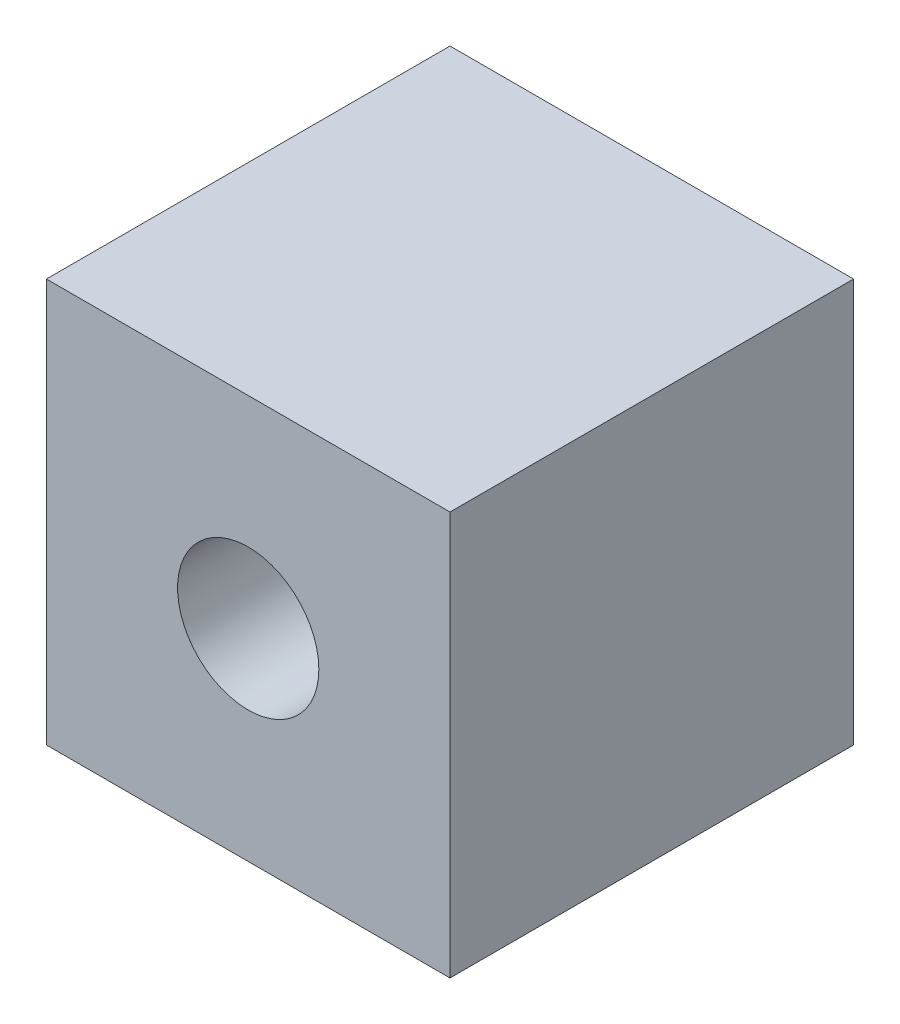
ISO-10303-21;
HEADER;
FILE_DESCRIPTION(('STEP AP214'),'2;1');
FILE_NAME('part.step','',(''),(''),'','','');
FILE_SCHEMA(('AUTOMOTIVE_DESIGN { 1 0 10303 214 1 1 1 1 }'));
ENDSEC;
DATA;
#1=APPLICATION_CONTEXT('core data for automotive mechanical design processes');
#2=APPLICATION_PROTOCOL_DEFINITION('international standard','automotive_design',2000,#1);
#3=PRODUCT_CONTEXT('',#1,'mechanical');
#4=PRODUCT('Part','Part','',(#3));
#5=PRODUCT_RELATED_PRODUCT_CATEGORY('part','',(#4));
#6=PRODUCT_DEFINITION_FORMATION('','',#4);
#7=PRODUCT_DEFINITION_CONTEXT('part definition',#1,'design');
#8=PRODUCT_DEFINITION('design','',#6,#7);
#9=PRODUCT_DEFINITION_SHAPE('','',#8);
#10=(LENGTH_UNIT() NAMED_UNIT(*) SI_UNIT(.MILLI.,.METRE.));
#11=(NAMED_UNIT(*) PLANE_ANGLE_UNIT() SI_UNIT($,.RADIAN.));
#12=(NAMED_UNIT(*) SI_UNIT($,.STERADIAN.) SOLID_ANGLE_UNIT());
#13=UNCERTAINTY_MEASURE_WITH_UNIT(LENGTH_MEASURE(1.E-05),#10,'distance_accuracy_value','');
#14=(GEOMETRIC_REPRESENTATION_CONTEXT(3) GLOBAL_UNCERTAINTY_ASSIGNED_CONTEXT((#13)) GLOBAL_UNIT_ASSIGNED_CONTEXT((#10,
#11,#12)) REPRESENTATION_CONTEXT('',''));
#15=CARTESIAN_POINT('',(0.,0.,0.));
#16=DIRECTION('',(0.,0.,1.));
#17=DIRECTION('',(1.,0.,0.));
#18=AXIS2_PLACEMENT_3D('',#15,#16,#17);
#19=CARTESIAN_POINT('',(0.,0.,10.16));
#20=DIRECTION('',(0.,0.,-1.));
#21=DIRECTION('',(-1.,0.,0.));
#22=AXIS2_PLACEMENT_3D('',#19,#20,#21);
#23=PLANE('',#22);
#24=DIRECTION('',(0.,-1.,0.));
#25=VECTOR('',#24,1.);
#26=CARTESIAN_POINT('',(0.,0.,10.16));
#27=LINE('',#26,#25);
#28=CARTESIAN_POINT('',(0.,10.16,10.16));
#29=VERTEX_POINT('',#28);
#30=CARTESIAN_POINT('',(0.,0.,10.16));
#31=VERTEX_POINT('',#30);
#32=EDGE_CURVE('E85',#29,#31,#27,.T.);
#33=ORIENTED_EDGE('',*,*,#32,.T.);
#34=DIRECTION('',(1.,0.,0.));
#35=VECTOR('',#34,1.);
#36=CARTESIAN_POINT('',(0.,0.,10.16));
#37=LINE('',#36,#35);
#38=CARTESIAN_POINT('',(10.16,0.,10.16));
#39=VERTEX_POINT('',#38);
#40=EDGE_CURVE('E80',#31,#39,#37,.T.);
#41=ORIENTED_EDGE('',*,*,#40,.T.);
#42=DIRECTION('',(0.,1.,0.));
#43=VECTOR('',#42,1.);
#44=CARTESIAN_POINT('',(10.16,0.,10.16));
#45=LINE('',#44,#43);
#46=CARTESIAN_POINT('',(10.16,10.16,10.16));
#47=VERTEX_POINT('',#46);
#48=EDGE_CURVE('E83',#39,#47,#45,.T.);
#49=ORIENTED_EDGE('',*,*,#48,.T.);
#50=DIRECTION('',(-1.,0.,0.));
#51=VECTOR('',#50,1.);
#52=CARTESIAN_POINT('',(0.,10.16,10.16));
#53=LINE('',#52,#51);
#54=EDGE_CURVE('E50',#47,#29,#53,.T.);
#55=ORIENTED_EDGE('',*,*,#54,.T.);
#56=EDGE_LOOP('',(#33,#41,#49,#55));
#57=FACE_BOUND('',#56,.T.);
#58=CARTESIAN_POINT('',(5.08,5.08,10.16));
#59=DIRECTION('',(0.,0.,1.));
#60=DIRECTION('',(1.,0.,0.));
#61=AXIS2_PLACEMENT_3D('',#58,#59,#60);
#62=CIRCLE('',#61,1.778);
#63=CARTESIAN_POINT('',(6.858,5.08,10.16));
#64=VERTEX_POINT('',#63);
#65=EDGE_CURVE('E100',#64,#64,#62,.T.);
#66=ORIENTED_EDGE('',*,*,#65,.F.);
#67=EDGE_LOOP('',(#66));
#68=FACE_BOUND('',#67,.T.);
#69=ADVANCED_FACE('F33',(#57,#68),#23,.F.);
#70=CARTESIAN_POINT('',(0.,0.,0.));
#71=DIRECTION('',(0.,0.,-1.));
#72=DIRECTION('',(-1.,0.,0.));
#73=AXIS2_PLACEMENT_3D('',#70,#71,#72);
#74=PLANE('',#73);
#75=DIRECTION('',(0.,-1.,0.));
#76=VECTOR('',#75,1.);
#77=CARTESIAN_POINT('',(0.,0.,0.));
#78=LINE('',#77,#76);
#79=CARTESIAN_POINT('',(0.,10.16,0.));
#80=VERTEX_POINT('',#79);
#81=CARTESIAN_POINT('',(0.,0.,0.));
#82=VERTEX_POINT('',#81);
#83=EDGE_CURVE('E97',#80,#82,#78,.T.);
#84=ORIENTED_EDGE('',*,*,#83,.F.);
#85=DIRECTION('',(-1.,0.,0.));
#86=VECTOR('',#85,1.);
#87=CARTESIAN_POINT('',(0.,10.16,0.));
#88=LINE('',#87,#86);
#89=CARTESIAN_POINT('',(10.16,10.16,0.));
#90=VERTEX_POINT('',#89);
#91=EDGE_CURVE('E73',#90,#80,#88,.T.);
#92=ORIENTED_EDGE('',*,*,#91,.F.);
#93=DIRECTION('',(0.,1.,0.));
#94=VECTOR('',#93,1.);
#95=CARTESIAN_POINT('',(10.16,0.,0.));
#96=LINE('',#95,#94);
#97=CARTESIAN_POINT('',(10.16,0.,0.));
#98=VERTEX_POINT('',#97);
#99=EDGE_CURVE('E67',#98,#90,#96,.T.);
#100=ORIENTED_EDGE('',*,*,#99,.F.);
#101=DIRECTION('',(1.,0.,0.));
#102=VECTOR('',#101,1.);
#103=CARTESIAN_POINT('',(0.,0.,0.));
#104=LINE('',#103,#102);
#105=EDGE_CURVE('E89',#82,#98,#104,.T.);
#106=ORIENTED_EDGE('',*,*,#105,.F.);
#107=EDGE_LOOP('',(#84,#92,#100,#106));
#108=FACE_BOUND('',#107,.T.);
#109=CARTESIAN_POINT('',(5.08,5.08,0.));
#110=DIRECTION('',(0.,0.,1.));
#111=DIRECTION('',(1.,0.,0.));
#112=AXIS2_PLACEMENT_3D('',#109,#110,#111);
#113=CIRCLE('',#112,1.778);
#114=CARTESIAN_POINT('',(6.858,5.08,0.));
#115=VERTEX_POINT('',#114);
#116=EDGE_CURVE('E112',#115,#115,#113,.T.);
#117=ORIENTED_EDGE('',*,*,#116,.T.);
#118=EDGE_LOOP('',(#117));
#119=FACE_BOUND('',#118,.T.);
#120=ADVANCED_FACE('F108',(#108,#119),#74,.T.);
#121=CARTESIAN_POINT('',(0.,0.,10.16));
#122=DIRECTION('',(1.,0.,0.));
#123=DIRECTION('',(0.,0.,-1.));
#124=AXIS2_PLACEMENT_3D('',#121,#122,#123);
#125=PLANE('',#124);
#126=ORIENTED_EDGE('',*,*,#83,.T.);
#127=DIRECTION('',(0.,0.,-1.));
#128=VECTOR('',#127,1.);
#129=CARTESIAN_POINT('',(0.,0.,10.16));
#130=LINE('',#129,#128);
#131=EDGE_CURVE('E11',#31,#82,#130,.T.);
#132=ORIENTED_EDGE('',*,*,#131,.F.);
#133=ORIENTED_EDGE('',*,*,#32,.F.);
#134=DIRECTION('',(0.,0.,-1.));
#135=VECTOR('',#134,1.);
#136=CARTESIAN_POINT('',(0.,10.16,10.16));
#137=LINE('',#136,#135);
#138=EDGE_CURVE('E93',#29,#80,#137,.T.);
#139=ORIENTED_EDGE('',*,*,#138,.T.);
#140=EDGE_LOOP('',(#126,#132,#133,#139));
#141=FACE_BOUND('',#140,.T.);
#142=ADVANCED_FACE('F35',(#141),#125,.F.);
#143=CARTESIAN_POINT('',(0.,0.,10.16));
#144=DIRECTION('',(0.,1.,0.));
#145=DIRECTION('',(0.,0.,1.));
#146=AXIS2_PLACEMENT_3D('',#143,#144,#145);
#147=PLANE('',#146);
#148=ORIENTED_EDGE('',*,*,#105,.T.);
#149=DIRECTION('',(0.,0.,-1.));
#150=VECTOR('',#149,1.);
#151=CARTESIAN_POINT('',(10.16,0.,10.16));
#152=LINE('',#151,#150);
#153=EDGE_CURVE('E42',#39,#98,#152,.T.);
#154=ORIENTED_EDGE('',*,*,#153,.F.);
#155=ORIENTED_EDGE('',*,*,#40,.F.);
#156=ORIENTED_EDGE('',*,*,#131,.T.);
#157=EDGE_LOOP('',(#148,#154,#155,#156));
#158=FACE_BOUND('',#157,.T.);
#159=ADVANCED_FACE('F88',(#158),#147,.F.);
#160=CARTESIAN_POINT('',(10.16,0.,10.16));
#161=DIRECTION('',(-1.,0.,0.));
#162=DIRECTION('',(0.,0.,1.));
#163=AXIS2_PLACEMENT_3D('',#160,#161,#162);
#164=PLANE('',#163);
#165=ORIENTED_EDGE('',*,*,#99,.T.);
#166=DIRECTION('',(0.,0.,-1.));
#167=VECTOR('',#166,1.);
#168=CARTESIAN_POINT('',(10.16,10.16,10.16));
#169=LINE('',#168,#167);
#170=EDGE_CURVE('E90',#47,#90,#169,.T.);
#171=ORIENTED_EDGE('',*,*,#170,.F.);
#172=ORIENTED_EDGE('',*,*,#48,.F.);
#173=ORIENTED_EDGE('',*,*,#153,.T.);
#174=EDGE_LOOP('',(#165,#171,#172,#173));
#175=FACE_BOUND('',#174,.T.);
#176=ADVANCED_FACE('F91',(#175),#164,.F.);
#177=CARTESIAN_POINT('',(0.,10.16,10.16));
#178=DIRECTION('',(0.,-1.,0.));
#179=DIRECTION('',(0.,0.,-1.));
#180=AXIS2_PLACEMENT_3D('',#177,#178,#179);
#181=PLANE('',#180);
#182=ORIENTED_EDGE('',*,*,#91,.T.);
#183=ORIENTED_EDGE('',*,*,#138,.F.);
#184=ORIENTED_EDGE('',*,*,#54,.F.);
#185=ORIENTED_EDGE('',*,*,#170,.T.);
#186=EDGE_LOOP('',(#182,#183,#184,#185));
#187=FACE_BOUND('',#186,.T.);
#188=ADVANCED_FACE('F105',(#187),#181,.F.);
#189=CARTESIAN_POINT('',(5.08,5.08,10.16));
#190=DIRECTION('',(0.,0.,-1.));
#191=DIRECTION('',(-1.,0.,0.));
#192=AXIS2_PLACEMENT_3D('',#189,#190,#191);
#193=CYLINDRICAL_SURFACE('',#192,1.778);
#194=ORIENTED_EDGE('',*,*,#65,.T.);
#195=EDGE_LOOP('',(#194));
#196=FACE_BOUND('',#195,.T.);
#197=ORIENTED_EDGE('',*,*,#116,.F.);
#198=EDGE_LOOP('',(#197));
#199=FACE_BOUND('',#198,.T.);
#200=ADVANCED_FACE('F118',(#196,#199),#193,.F.);
#201=CLOSED_SHELL('',(#69,#120,#142,#159,#176,#188,#200));
#202=MANIFOLD_SOLID_BREP('B2',#201);
#203=ADVANCED_BREP_SHAPE_REPRESENTATION('',(#18,#202),#14);
#204=SHAPE_DEFINITION_REPRESENTATION(#9,#203);
ENDSEC;
END-ISO-10303-21;
